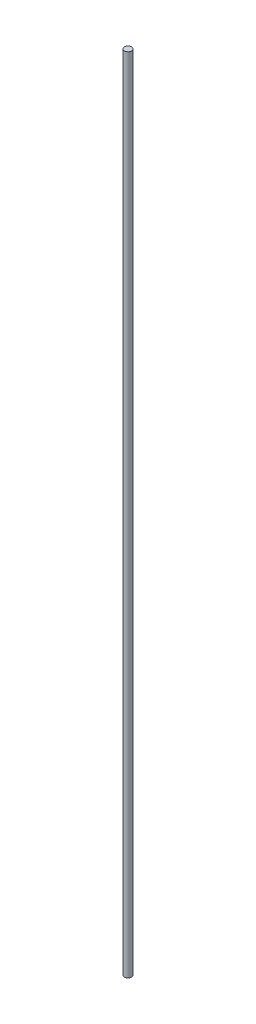
ISO-10303-21;
HEADER;
FILE_DESCRIPTION(('STEP AP214'),'2;1');
FILE_NAME('part.step','',(''),(''),'','','');
FILE_SCHEMA(('AUTOMOTIVE_DESIGN { 1 0 10303 214 1 1 1 1 }'));
ENDSEC;
DATA;
#1=APPLICATION_CONTEXT('core data for automotive mechanical design processes');
#2=APPLICATION_PROTOCOL_DEFINITION('international standard','automotive_design',2000,#1);
#3=PRODUCT_CONTEXT('',#1,'mechanical');
#4=PRODUCT('Part','Part','',(#3));
#5=PRODUCT_RELATED_PRODUCT_CATEGORY('part','',(#4));
#6=PRODUCT_DEFINITION_FORMATION('','',#4);
#7=PRODUCT_DEFINITION_CONTEXT('part definition',#1,'design');
#8=PRODUCT_DEFINITION('design','',#6,#7);
#9=PRODUCT_DEFINITION_SHAPE('','',#8);
#10=(LENGTH_UNIT() NAMED_UNIT(*) SI_UNIT(.MILLI.,.METRE.));
#11=(NAMED_UNIT(*) PLANE_ANGLE_UNIT() SI_UNIT($,.RADIAN.));
#12=(NAMED_UNIT(*) SI_UNIT($,.STERADIAN.) SOLID_ANGLE_UNIT());
#13=UNCERTAINTY_MEASURE_WITH_UNIT(LENGTH_MEASURE(1.E-05),#10,'distance_accuracy_value','');
#14=(GEOMETRIC_REPRESENTATION_CONTEXT(3) GLOBAL_UNCERTAINTY_ASSIGNED_CONTEXT((#13)) GLOBAL_UNIT_ASSIGNED_CONTEXT((#10,
#11,#12)) REPRESENTATION_CONTEXT('',''));
#15=CARTESIAN_POINT('',(0.,0.,0.));
#16=DIRECTION('',(0.,0.,1.));
#17=DIRECTION('',(1.,0.,0.));
#18=AXIS2_PLACEMENT_3D('',#15,#16,#17);
#19=CARTESIAN_POINT('',(0.,887.03,0.));
#20=DIRECTION('',(0.,-1.,0.));
#21=DIRECTION('',(0.,0.,-1.));
#22=AXIS2_PLACEMENT_3D('',#19,#20,#21);
#23=CYLINDRICAL_SURFACE('',#22,4.);
#24=CARTESIAN_POINT('',(0.,0.,0.));
#25=DIRECTION('',(0.,1.,0.));
#26=DIRECTION('',(0.,0.,1.));
#27=AXIS2_PLACEMENT_3D('',#24,#25,#26);
#28=CIRCLE('',#27,4.);
#29=CARTESIAN_POINT('',(0.,-1.11022302462516E-13,-4.));
#30=VERTEX_POINT('',#29);
#31=EDGE_CURVE('E10',#30,#30,#28,.T.);
#32=CARTESIAN_POINT('',(0.,905.03,0.));
#33=DIRECTION('',(0.,1.,0.));
#34=DIRECTION('',(0.,0.,1.));
#35=AXIS2_PLACEMENT_3D('',#32,#33,#34);
#36=CIRCLE('',#35,4.);
#37=CARTESIAN_POINT('',(0.,905.03,-4.));
#38=VERTEX_POINT('',#37);
#39=EDGE_CURVE('E43',#38,#38,#36,.T.);
#40=CARTESIAN_POINT('',(0.,-1.11022302462516E-13,-4.));
#41=CARTESIAN_POINT('',(0.,9.42739583333321,-4.));
#42=CARTESIAN_POINT('',(0.,18.8547916666666,-4.));
#43=CARTESIAN_POINT('',(0.,37.7095833333332,-4.));
#44=CARTESIAN_POINT('',(0.,47.1369791666666,-4.));
#45=CARTESIAN_POINT('',(0.,65.9917708333332,-4.));
#46=CARTESIAN_POINT('',(0.,75.4191666666666,-4.));
#47=CARTESIAN_POINT('',(0.,94.2739583333332,-4.));
#48=CARTESIAN_POINT('',(0.,103.701354166667,-4.));
#49=CARTESIAN_POINT('',(0.,122.556145833333,-4.));
#50=CARTESIAN_POINT('',(0.,131.983541666667,-4.));
#51=CARTESIAN_POINT('',(0.,150.838333333333,-4.));
#52=CARTESIAN_POINT('',(0.,160.265729166667,-4.));
#53=CARTESIAN_POINT('',(0.,179.120520833333,-4.));
#54=CARTESIAN_POINT('',(0.,188.547916666667,-4.));
#55=CARTESIAN_POINT('',(0.,207.402708333333,-4.));
#56=CARTESIAN_POINT('',(0.,216.830104166667,-4.));
#57=CARTESIAN_POINT('',(0.,235.684895833333,-4.));
#58=CARTESIAN_POINT('',(0.,245.112291666667,-4.));
#59=CARTESIAN_POINT('',(0.,263.967083333333,-4.));
#60=CARTESIAN_POINT('',(0.,273.394479166667,-4.));
#61=CARTESIAN_POINT('',(0.,292.249270833333,-4.));
#62=CARTESIAN_POINT('',(0.,301.676666666667,-4.));
#63=CARTESIAN_POINT('',(0.,320.531458333333,-4.));
#64=CARTESIAN_POINT('',(0.,329.958854166667,-4.));
#65=CARTESIAN_POINT('',(0.,348.813645833333,-4.));
#66=CARTESIAN_POINT('',(0.,358.241041666667,-4.));
#67=CARTESIAN_POINT('',(0.,377.095833333333,-4.));
#68=CARTESIAN_POINT('',(0.,386.523229166667,-4.));
#69=CARTESIAN_POINT('',(0.,405.378020833333,-4.));
#70=CARTESIAN_POINT('',(0.,414.805416666667,-4.));
#71=CARTESIAN_POINT('',(0.,433.660208333333,-4.));
#72=CARTESIAN_POINT('',(0.,443.087604166667,-4.));
#73=CARTESIAN_POINT('',(0.,461.942395833333,-4.));
#74=CARTESIAN_POINT('',(0.,471.369791666667,-4.));
#75=CARTESIAN_POINT('',(0.,490.224583333333,-4.));
#76=CARTESIAN_POINT('',(0.,499.651979166667,-4.));
#77=CARTESIAN_POINT('',(0.,518.506770833333,-4.));
#78=CARTESIAN_POINT('',(0.,527.934166666667,-4.));
#79=CARTESIAN_POINT('',(0.,546.788958333333,-4.));
#80=CARTESIAN_POINT('',(0.,556.216354166667,-4.));
#81=CARTESIAN_POINT('',(0.,575.071145833333,-4.));
#82=CARTESIAN_POINT('',(0.,584.498541666667,-4.));
#83=CARTESIAN_POINT('',(0.,603.353333333333,-4.));
#84=CARTESIAN_POINT('',(0.,612.780729166667,-4.));
#85=CARTESIAN_POINT('',(0.,631.635520833333,-4.));
#86=CARTESIAN_POINT('',(0.,641.062916666667,-4.));
#87=CARTESIAN_POINT('',(0.,659.917708333333,-4.));
#88=CARTESIAN_POINT('',(0.,669.345104166667,-4.));
#89=CARTESIAN_POINT('',(0.,688.199895833333,-4.));
#90=CARTESIAN_POINT('',(0.,697.627291666667,-4.));
#91=CARTESIAN_POINT('',(0.,716.482083333333,-4.));
#92=CARTESIAN_POINT('',(0.,725.909479166667,-4.));
#93=CARTESIAN_POINT('',(0.,744.764270833333,-4.));
#94=CARTESIAN_POINT('',(0.,754.191666666667,-4.));
#95=CARTESIAN_POINT('',(0.,773.046458333333,-4.));
#96=CARTESIAN_POINT('',(0.,782.473854166667,-4.));
#97=CARTESIAN_POINT('',(0.,801.328645833333,-4.));
#98=CARTESIAN_POINT('',(0.,810.756041666667,-4.));
#99=CARTESIAN_POINT('',(0.,829.610833333333,-4.));
#100=CARTESIAN_POINT('',(0.,839.038229166667,-4.));
#101=CARTESIAN_POINT('',(0.,857.893020833333,-4.));
#102=CARTESIAN_POINT('',(0.,867.320416666667,-4.));
#103=CARTESIAN_POINT('',(0.,886.175208333333,-4.));
#104=CARTESIAN_POINT('',(0.,895.602604166667,-4.));
#105=CARTESIAN_POINT('',(0.,905.03,-4.));
#106=B_SPLINE_CURVE_WITH_KNOTS('',3,(#40,#41,#42,#43,#44,#45,#46,#47,#48,#49,#50,#51,#52,#53,
#54,#55,#56,#57,#58,#59,#60,#61,#62,#63,#64,#65,#66,#67,#68,#69,#70,#71,#72,#73,#74,#75,#76,#77,
#78,#79,#80,#81,#82,#83,#84,#85,#86,#87,#88,#89,#90,#91,#92,#93,#94,#95,#96,#97,#98,#99,#100,
#101,#102,#103,#104,#105),.UNSPECIFIED.,.F.,.F.,(4,2,2,2,2,2,2,2,2,2,2,2,2,2,2,2,2,2,2,2,2,2,2,
2,2,2,2,2,2,2,2,2,4),(0.,28.2821875,56.564375,84.8465625,113.12875,141.4109375,169.693125,
197.9753125,226.2575,254.5396875,282.821875,311.1040625,339.38625,367.6684375,395.950625,
424.2328125,452.515,480.7971875,509.079375,537.3615625,565.64375,593.9259375,622.208125,
650.4903125,678.7725,707.0546875,735.336875,763.6190625,791.90125,820.1834375,848.465625,
876.7478125,905.03),.UNSPECIFIED.);
#107=EDGE_CURVE('BSEAM37',#30,#38,#106,.T.);
#108=ORIENTED_EDGE('',*,*,#31,.T.);
#109=ORIENTED_EDGE('',*,*,#39,.F.);
#110=ORIENTED_EDGE('',*,*,#107,.T.);
#111=ORIENTED_EDGE('',*,*,#107,.F.);
#112=EDGE_LOOP('',(#108,#110,#109,#111));
#113=FACE_BOUND('',#112,.T.);
#114=ADVANCED_FACE('F37',(#113),#23,.T.);
#115=CARTESIAN_POINT('',(0.,0.,0.));
#116=DIRECTION('',(0.,1.,0.));
#117=DIRECTION('',(0.,0.,1.));
#118=AXIS2_PLACEMENT_3D('',#115,#116,#117);
#119=PLANE('',#118);
#120=ORIENTED_EDGE('',*,*,#31,.F.);
#121=EDGE_LOOP('',(#120));
#122=FACE_BOUND('',#121,.T.);
#123=ADVANCED_FACE('F52',(#122),#119,.F.);
#124=CARTESIAN_POINT('',(0.,905.03,0.));
#125=DIRECTION('',(0.,1.,0.));
#126=DIRECTION('',(0.,0.,1.));
#127=AXIS2_PLACEMENT_3D('',#124,#125,#126);
#128=PLANE('',#127);
#129=ORIENTED_EDGE('',*,*,#39,.T.);
#130=EDGE_LOOP('',(#129));
#131=FACE_BOUND('',#130,.T.);
#132=ADVANCED_FACE('F49',(#131),#128,.T.);
#133=CLOSED_SHELL('',(#114,#123,#132));
#134=MANIFOLD_SOLID_BREP('B2',#133);
#135=ADVANCED_BREP_SHAPE_REPRESENTATION('',(#18,#134),#14);
#136=SHAPE_DEFINITION_REPRESENTATION(#9,#135);
ENDSEC;
END-ISO-10303-21;
